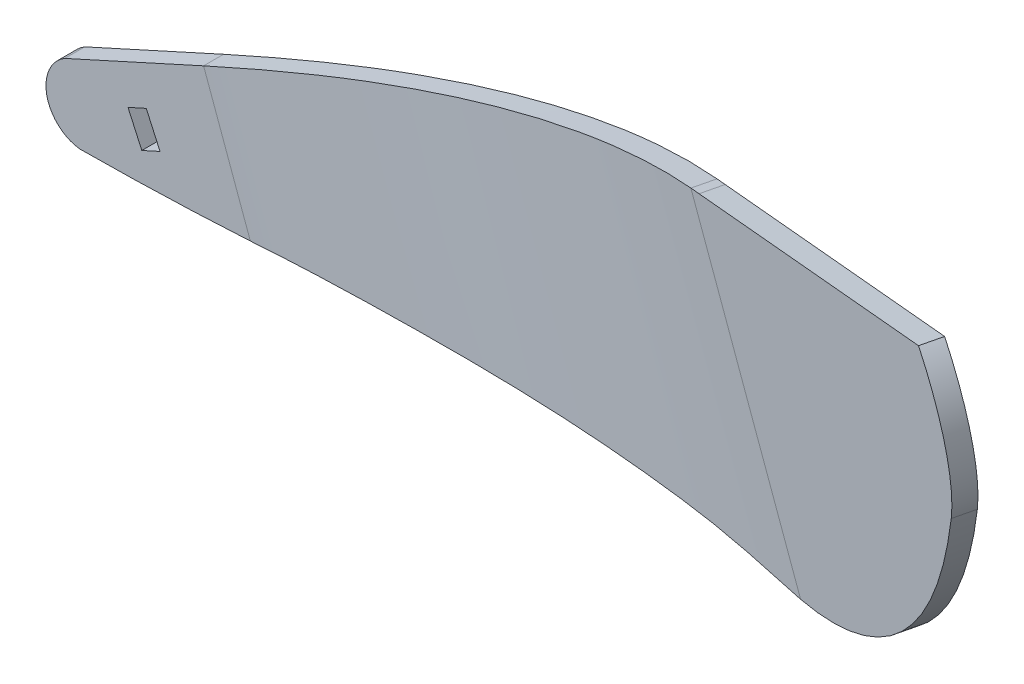
ISO-10303-21;
HEADER;
FILE_DESCRIPTION(('STEP AP214'),'2;1');
FILE_NAME('part.step','',(''),(''),'','','');
FILE_SCHEMA(('AUTOMOTIVE_DESIGN { 1 0 10303 214 1 1 1 1 }'));
ENDSEC;
DATA;
#1=APPLICATION_CONTEXT('core data for automotive mechanical design processes');
#2=APPLICATION_PROTOCOL_DEFINITION('international standard','automotive_design',2000,#1);
#3=PRODUCT_CONTEXT('',#1,'mechanical');
#4=PRODUCT('Part','Part','',(#3));
#5=PRODUCT_RELATED_PRODUCT_CATEGORY('part','',(#4));
#6=PRODUCT_DEFINITION_FORMATION('','',#4);
#7=PRODUCT_DEFINITION_CONTEXT('part definition',#1,'design');
#8=PRODUCT_DEFINITION('design','',#6,#7);
#9=PRODUCT_DEFINITION_SHAPE('','',#8);
#10=(LENGTH_UNIT() NAMED_UNIT(*) SI_UNIT(.MILLI.,.METRE.));
#11=(NAMED_UNIT(*) PLANE_ANGLE_UNIT() SI_UNIT($,.RADIAN.));
#12=(NAMED_UNIT(*) SI_UNIT($,.STERADIAN.) SOLID_ANGLE_UNIT());
#13=UNCERTAINTY_MEASURE_WITH_UNIT(LENGTH_MEASURE(1.E-05),#10,'distance_accuracy_value','');
#14=(GEOMETRIC_REPRESENTATION_CONTEXT(3) GLOBAL_UNCERTAINTY_ASSIGNED_CONTEXT((#13)) GLOBAL_UNIT_ASSIGNED_CONTEXT((#10,
#11,#12)) REPRESENTATION_CONTEXT('',''));
#15=CARTESIAN_POINT('',(0.,0.,0.));
#16=DIRECTION('',(0.,0.,1.));
#17=DIRECTION('',(1.,0.,0.));
#18=AXIS2_PLACEMENT_3D('',#15,#16,#17);
#19=CARTESIAN_POINT('',(83.014106092908,142.239745588982,13.0819028788313));
#20=DIRECTION('',(0.397093410751114,0.144647911477414,-0.906307787036649));
#21=DIRECTION('',(0.917283463911632,-0.0301308807093948,0.397093410751114));
#22=AXIS2_PLACEMENT_3D('',#19,#20,#21);
#23=CYLINDRICAL_SURFACE('',#22,58.3606331759639);
#24=CARTESIAN_POINT('',(83.6192764508927,142.460189006073,11.7006898113874));
#25=DIRECTION('',(-0.397093410751114,-0.144647911477414,0.90630778703665));
#26=DIRECTION('',(0.917283463911632,-0.0301308807093948,0.397093410751114));
#27=AXIS2_PLACEMENT_3D('',#24,#25,#26);
#28=CIRCLE('',#27,58.3606331759639);
#29=CARTESIAN_POINT('',(104.279360920723,87.8798983524995,12.0416979789016));
#30=VERTEX_POINT('',#29);
#31=CARTESIAN_POINT('',(132.600445425095,115.799936331135,28.9064887736133));
#32=VERTEX_POINT('',#31);
#33=EDGE_CURVE('E351',#30,#32,#28,.T.);
#34=ORIENTED_EDGE('',*,*,#33,.T.);
#35=DIRECTION('',(0.397093410751114,0.144647911477414,-0.906307787036649));
#36=VECTOR('',#35,1.);
#37=CARTESIAN_POINT('',(131.99527506711,115.579492914043,30.2877018410572));
#38=LINE('',#37,#36);
#39=CARTESIAN_POINT('',(131.99527506711,115.579492914043,30.2877018410572));
#40=VERTEX_POINT('',#39);
#41=EDGE_CURVE('E436',#40,#32,#38,.T.);
#42=ORIENTED_EDGE('',*,*,#41,.F.);
#43=CARTESIAN_POINT('',(83.014106092908,142.239745588982,13.0819028788313));
#44=DIRECTION('',(-0.397093410751114,-0.144647911477414,0.90630778703665));
#45=DIRECTION('',(0.917283463911632,-0.0301308807093948,0.397093410751114));
#46=AXIS2_PLACEMENT_3D('',#43,#44,#45);
#47=CIRCLE('',#46,58.3606331759639);
#48=CARTESIAN_POINT('',(103.674190562738,87.6594549354078,13.4229110463455));
#49=VERTEX_POINT('',#48);
#50=EDGE_CURVE('E421',#49,#40,#47,.T.);
#51=ORIENTED_EDGE('',*,*,#50,.F.);
#52=CARTESIAN_POINT('',(104.279360920723,87.8798983524994,12.0416979789016));
#53=CARTESIAN_POINT('',(103.674190562738,87.6594549354079,13.4229110463455));
#54=B_SPLINE_CURVE_WITH_KNOTS('',1,(#52,#53),.UNSPECIFIED.,.F.,.F.,(2,2),(0.,1.),.UNSPECIFIED.);
#55=EDGE_CURVE('E301',#30,#49,#54,.T.);
#56=ORIENTED_EDGE('',*,*,#55,.F.);
#57=EDGE_LOOP('',(#34,#42,#51,#56));
#58=FACE_BOUND('',#57,.T.);
#59=ADVANCED_FACE('F36',(#58),#23,.T.);
#60=CARTESIAN_POINT('',(96.5992940794356,111.170574986929,14.0754924818592));
#61=DIRECTION('',(-0.40636219666363,0.913140755774543,-0.0323067371643325));
#62=DIRECTION('',(-0.822913475561529,-0.381118015644391,-0.421381620257132));
#63=AXIS2_PLACEMENT_3D('',#60,#61,#62);
#64=PLANE('',#63);
#65=DIRECTION('',(-0.822913475561529,-0.381118015644391,-0.421381620257132));
#66=VECTOR('',#65,1.);
#67=CARTESIAN_POINT('',(96.5992940794356,111.170574986929,14.0754924818592));
#68=LINE('',#67,#66);
#69=CARTESIAN_POINT('',(96.5992940794356,111.170574986929,14.0754924818592));
#70=VERTEX_POINT('',#69);
#71=CARTESIAN_POINT('',(95.3248719609345,110.580348622529,13.4229110463455));
#72=VERTEX_POINT('',#71);
#73=EDGE_CURVE('E423',#70,#72,#68,.T.);
#74=ORIENTED_EDGE('',*,*,#73,.F.);
#75=DIRECTION('',(0.397093410751114,0.144647911477414,-0.906307787036649));
#76=VECTOR('',#75,1.);
#77=CARTESIAN_POINT('',(96.5992940794356,111.170574986929,14.0754924818592));
#78=LINE('',#77,#76);
#79=CARTESIAN_POINT('',(97.2044644374203,111.391018404021,12.6942794144154));
#80=VERTEX_POINT('',#79);
#81=EDGE_CURVE('E430',#70,#80,#78,.T.);
#82=ORIENTED_EDGE('',*,*,#81,.T.);
#83=DIRECTION('',(-0.822913475561529,-0.381118015644391,-0.421381620257132));
#84=VECTOR('',#83,1.);
#85=CARTESIAN_POINT('',(97.2044644374203,111.391018404021,12.6942794144154));
#86=LINE('',#85,#84);
#87=CARTESIAN_POINT('',(95.9300423189192,110.800792039621,12.0416979789017));
#88=VERTEX_POINT('',#87);
#89=EDGE_CURVE('E429',#80,#88,#86,.T.);
#90=ORIENTED_EDGE('',*,*,#89,.T.);
#91=CARTESIAN_POINT('',(95.3248719609345,110.580348622529,13.4229110463455));
#92=CARTESIAN_POINT('',(95.9300423189192,110.80079203962,12.0416979789016));
#93=B_SPLINE_CURVE_WITH_KNOTS('',1,(#91,#92),.UNSPECIFIED.,.F.,.F.,(2,2),(0.,1.),.UNSPECIFIED.);
#94=EDGE_CURVE('E11',#72,#88,#93,.T.);
#95=ORIENTED_EDGE('',*,*,#94,.F.);
#96=EDGE_LOOP('',(#74,#82,#90,#95));
#97=FACE_BOUND('',#96,.T.);
#98=ADVANCED_FACE('F38',(#97),#64,.T.);
#99=CARTESIAN_POINT('',(32.7005911916889,324.934882128188,18.5141685714529));
#100=DIRECTION('',(0.397093410751114,0.144647911477414,-0.90630778703665));
#101=DIRECTION('',(0.917283463911632,-0.0301308807093948,0.397093410751114));
#102=AXIS2_PLACEMENT_3D('',#99,#100,#101);
#103=PLANE('',#102);
#104=ORIENTED_EDGE('',*,*,#89,.F.);
#105=DIRECTION('',(-0.822784282779922,-0.381408213456814,-0.421371331153426));
#106=VECTOR('',#105,1.);
#107=CARTESIAN_POINT('',(131.427037788079,127.255165100489,30.2206366748398));
#108=LINE('',#107,#106);
#109=CARTESIAN_POINT('',(131.427037788079,127.255165100489,30.2206366748398));
#110=VERTEX_POINT('',#109);
#111=EDGE_CURVE('E427',#110,#80,#108,.T.);
#112=ORIENTED_EDGE('',*,*,#111,.F.);
#113=CARTESIAN_POINT('',(122.932266417406,121.062287162069,25.5103112666063));
#114=DIRECTION('',(-0.397093410751114,-0.144647911477414,0.90630778703665));
#115=DIRECTION('',(0.917283463911632,-0.0301308807093948,0.397093410751114));
#116=AXIS2_PLACEMENT_3D('',#113,#114,#115);
#117=CIRCLE('',#116,11.5195504795819);
#118=EDGE_CURVE('E424',#32,#110,#117,.T.);
#119=ORIENTED_EDGE('',*,*,#118,.F.);
#120=ORIENTED_EDGE('',*,*,#33,.F.);
#121=DIRECTION('',(0.342266117137559,-0.93960305717871,0.));
#122=VECTOR('',#121,1.);
#123=CARTESIAN_POINT('',(19.6586583606416,320.184140125012,12.0416979789016));
#124=LINE('',#123,#122);
#125=EDGE_CURVE('E48',#88,#30,#124,.T.);
#126=ORIENTED_EDGE('',*,*,#125,.F.);
#127=EDGE_LOOP('',(#104,#112,#119,#120,#126));
#128=FACE_BOUND('',#127,.T.);
#129=ADVANCED_FACE('F476',(#128),#103,.T.);
#130=CARTESIAN_POINT('',(130.821867430095,127.034721683398,31.6018497422836));
#131=DIRECTION('',(-0.406623716903448,0.91301958161526,-0.0324406602694974));
#132=DIRECTION('',(-0.822784282779922,-0.381408213456814,-0.421371331153426));
#133=AXIS2_PLACEMENT_3D('',#130,#131,#132);
#134=PLANE('',#133);
#135=ORIENTED_EDGE('',*,*,#111,.T.);
#136=ORIENTED_EDGE('',*,*,#81,.F.);
#137=DIRECTION('',(-0.822784282779922,-0.381408213456814,-0.421371331153426));
#138=VECTOR('',#137,1.);
#139=CARTESIAN_POINT('',(130.821867430095,127.034721683398,31.6018497422836));
#140=LINE('',#139,#138);
#141=CARTESIAN_POINT('',(130.821867430095,127.034721683398,31.6018497422836));
#142=VERTEX_POINT('',#141);
#143=EDGE_CURVE('E420',#142,#70,#140,.T.);
#144=ORIENTED_EDGE('',*,*,#143,.F.);
#145=DIRECTION('',(0.397093410751114,0.144647911477414,-0.906307787036649));
#146=VECTOR('',#145,1.);
#147=CARTESIAN_POINT('',(130.821867430095,127.034721683398,31.6018497422836));
#148=LINE('',#147,#146);
#149=EDGE_CURVE('E434',#142,#110,#148,.T.);
#150=ORIENTED_EDGE('',*,*,#149,.T.);
#151=EDGE_LOOP('',(#135,#136,#144,#150));
#152=FACE_BOUND('',#151,.T.);
#153=ADVANCED_FACE('F402',(#152),#134,.T.);
#154=CARTESIAN_POINT('',(122.327096059422,120.841843744977,26.8915243340501));
#155=DIRECTION('',(0.397093410751114,0.144647911477414,-0.906307787036649));
#156=DIRECTION('',(0.917283463911632,-0.0301308807093948,0.397093410751114));
#157=AXIS2_PLACEMENT_3D('',#154,#155,#156);
#158=CYLINDRICAL_SURFACE('',#157,11.5195504795819);
#159=ORIENTED_EDGE('',*,*,#118,.T.);
#160=ORIENTED_EDGE('',*,*,#149,.F.);
#161=CARTESIAN_POINT('',(122.327096059422,120.841843744977,26.8915243340501));
#162=DIRECTION('',(-0.397093410751114,-0.144647911477414,0.90630778703665));
#163=DIRECTION('',(0.917283463911632,-0.0301308807093948,0.397093410751114));
#164=AXIS2_PLACEMENT_3D('',#161,#162,#163);
#165=CIRCLE('',#164,11.5195504795819);
#166=EDGE_CURVE('E418',#40,#142,#165,.T.);
#167=ORIENTED_EDGE('',*,*,#166,.F.);
#168=ORIENTED_EDGE('',*,*,#41,.T.);
#169=EDGE_LOOP('',(#159,#160,#167,#168));
#170=FACE_BOUND('',#169,.T.);
#171=ADVANCED_FACE('F480',(#170),#158,.T.);
#172=CARTESIAN_POINT('',(32.0954208337042,324.714438711096,19.8953816388968));
#173=DIRECTION('',(0.397093410751114,0.144647911477414,-0.90630778703665));
#174=DIRECTION('',(0.917283463911632,-0.0301308807093948,0.397093410751114));
#175=AXIS2_PLACEMENT_3D('',#172,#173,#174);
#176=PLANE('',#175);
#177=DIRECTION('',(0.342266117137559,-0.93960305717871,0.));
#178=VECTOR('',#177,1.);
#179=CARTESIAN_POINT('',(19.0534880026569,319.96369670792,13.4229110463455));
#180=LINE('',#179,#178);
#181=EDGE_CURVE('E433',#72,#49,#180,.T.);
#182=ORIENTED_EDGE('',*,*,#181,.T.);
#183=ORIENTED_EDGE('',*,*,#50,.T.);
#184=ORIENTED_EDGE('',*,*,#166,.T.);
#185=ORIENTED_EDGE('',*,*,#143,.T.);
#186=ORIENTED_EDGE('',*,*,#73,.T.);
#187=EDGE_LOOP('',(#182,#183,#184,#185,#186));
#188=FACE_BOUND('',#187,.T.);
#189=ADVANCED_FACE('F483',(#188),#176,.F.);
#190=CARTESIAN_POINT('',(37.2781516197468,80.901977041363,1.524));
#191=DIRECTION('',(0.,0.,-1.));
#192=DIRECTION('',(1.,0.,0.));
#193=AXIS2_PLACEMENT_3D('',#190,#191,#192);
#194=CYLINDRICAL_SURFACE('',#193,2.91276832147742);
#195=CARTESIAN_POINT('',(37.2781516197468,80.901977041363,0.));
#196=DIRECTION('',(0.,0.,1.));
#197=DIRECTION('',(-1.,0.,0.));
#198=AXIS2_PLACEMENT_3D('',#195,#196,#197);
#199=CIRCLE('',#198,2.91276832147742);
#200=CARTESIAN_POINT('',(35.7950190023547,83.4088749120052,0.));
#201=VERTEX_POINT('',#200);
#202=CARTESIAN_POINT('',(36.9222362440405,78.0110354058507,0.));
#203=VERTEX_POINT('',#202);
#204=EDGE_CURVE('E353',#201,#203,#199,.T.);
#205=ORIENTED_EDGE('',*,*,#204,.T.);
#206=DIRECTION('',(0.,0.,-1.));
#207=VECTOR('',#206,1.);
#208=CARTESIAN_POINT('',(36.9222362440405,78.0110354058507,1.524));
#209=LINE('',#208,#207);
#210=CARTESIAN_POINT('',(36.9222362440405,78.0110354058507,1.524));
#211=VERTEX_POINT('',#210);
#212=EDGE_CURVE('E358',#211,#203,#209,.T.);
#213=ORIENTED_EDGE('',*,*,#212,.F.);
#214=CARTESIAN_POINT('',(37.2781516197468,80.901977041363,1.524));
#215=DIRECTION('',(0.,0.,1.));
#216=DIRECTION('',(-1.,0.,0.));
#217=AXIS2_PLACEMENT_3D('',#214,#215,#216);
#218=CIRCLE('',#217,2.91276832147742);
#219=CARTESIAN_POINT('',(35.7950190023547,83.4088749120052,1.524));
#220=VERTEX_POINT('',#219);
#221=EDGE_CURVE('E362',#220,#211,#218,.T.);
#222=ORIENTED_EDGE('',*,*,#221,.F.);
#223=DIRECTION('',(0.,0.,-1.));
#224=VECTOR('',#223,1.);
#225=CARTESIAN_POINT('',(35.7950190023547,83.4088749120052,1.524));
#226=LINE('',#225,#224);
#227=EDGE_CURVE('E343',#220,#201,#226,.T.);
#228=ORIENTED_EDGE('',*,*,#227,.T.);
#229=EDGE_LOOP('',(#205,#213,#222,#228));
#230=FACE_BOUND('',#229,.T.);
#231=ADVANCED_FACE('F564',(#230),#194,.T.);
#232=CARTESIAN_POINT('',(35.3300841042553,325.892718868233,1.524));
#233=DIRECTION('',(0.,0.,-1.));
#234=DIRECTION('',(1.,0.,0.));
#235=AXIS2_PLACEMENT_3D('',#232,#233,#234);
#236=PLANE('',#235);
#237=DIRECTION('',(-0.413091850992311,0.910689366712792,0.));
#238=VECTOR('',#237,1.);
#239=CARTESIAN_POINT('',(41.9946653098515,83.2168798130125,1.524));
#240=LINE('',#239,#238);
#241=CARTESIAN_POINT('',(43.0439186113719,80.903728821562,1.524));
#242=VERTEX_POINT('',#241);
#243=CARTESIAN_POINT('',(41.9946653098515,83.2168798130125,1.524));
#244=VERTEX_POINT('',#243);
#245=EDGE_CURVE('E148',#242,#244,#240,.T.);
#246=ORIENTED_EDGE('',*,*,#245,.F.);
#247=DIRECTION('',(0.910689366712794,0.413091850992307,0.));
#248=VECTOR('',#247,1.);
#249=CARTESIAN_POINT('',(41.6560280165016,80.2741768406497,1.524));
#250=LINE('',#249,#248);
#251=CARTESIAN_POINT('',(41.6560280165017,80.2741768406497,1.524));
#252=VERTEX_POINT('',#251);
#253=EDGE_CURVE('E161',#252,#242,#250,.T.);
#254=ORIENTED_EDGE('',*,*,#253,.F.);
#255=DIRECTION('',(0.413091850992311,-0.910689366712792,0.));
#256=VECTOR('',#255,1.);
#257=CARTESIAN_POINT('',(40.6067747149812,82.5873278321002,1.524));
#258=LINE('',#257,#256);
#259=CARTESIAN_POINT('',(40.6067747149812,82.5873278321002,1.524));
#260=VERTEX_POINT('',#259);
#261=EDGE_CURVE('E143',#260,#252,#258,.T.);
#262=ORIENTED_EDGE('',*,*,#261,.F.);
#263=DIRECTION('',(-0.910689366712794,-0.413091850992307,0.));
#264=VECTOR('',#263,1.);
#265=CARTESIAN_POINT('',(40.6067747149812,82.5873278321002,1.524));
#266=LINE('',#265,#264);
#267=EDGE_CURVE('E151',#244,#260,#266,.T.);
#268=ORIENTED_EDGE('',*,*,#267,.F.);
#269=EDGE_LOOP('',(#246,#254,#262,#268));
#270=FACE_BOUND('',#269,.T.);
#271=DIRECTION('',(-0.910689366712793,-0.413091850992309,0.));
#272=VECTOR('',#271,1.);
#273=CARTESIAN_POINT('',(98.6216454393514,111.907250269281,1.524));
#274=LINE('',#273,#272);
#275=CARTESIAN_POINT('',(46.3551161989758,88.1989715762025,1.524));
#276=VERTEX_POINT('',#275);
#277=EDGE_CURVE('E352',#276,#220,#274,.T.);
#278=ORIENTED_EDGE('',*,*,#277,.T.);
#279=ORIENTED_EDGE('',*,*,#221,.T.);
#280=CARTESIAN_POINT('',(35.3300841042553,325.892718868233,1.524));
#281=DIRECTION('',(0.,0.,1.));
#282=DIRECTION('',(1.,0.,0.));
#283=AXIS2_PLACEMENT_3D('',#280,#281,#282);
#284=CIRCLE('',#283,247.886796632215);
#285=CARTESIAN_POINT('',(49.9117445695242,78.4351687254731,1.52399999999997));
#286=VERTEX_POINT('',#285);
#287=EDGE_CURVE('E365',#211,#286,#284,.T.);
#288=ORIENTED_EDGE('',*,*,#287,.T.);
#289=DIRECTION('',(0.342266117137559,-0.93960305717871,0.));
#290=VECTOR('',#289,1.);
#291=CARTESIAN_POINT('',(-31.3773751627346,301.593411950288,1.524));
#292=LINE('',#291,#290);
#293=EDGE_CURVE('E361',#276,#286,#292,.T.);
#294=ORIENTED_EDGE('',*,*,#293,.F.);
#295=EDGE_LOOP('',(#278,#279,#288,#294));
#296=FACE_BOUND('',#295,.T.);
#297=ADVANCED_FACE('F159',(#270,#296),#236,.F.);
#298=CARTESIAN_POINT('',(35.3300841042553,325.892718868233,1.524));
#299=DIRECTION('',(0.,0.,-1.));
#300=DIRECTION('',(1.,0.,0.));
#301=AXIS2_PLACEMENT_3D('',#298,#299,#300);
#302=CYLINDRICAL_SURFACE('',#301,247.886796632215);
#303=CARTESIAN_POINT('',(49.9117445695242,78.4351687254731,1.52399999999997));
#304=CARTESIAN_POINT('',(49.9117445695242,78.4351687254731,0.));
#305=B_SPLINE_CURVE_WITH_KNOTS('',1,(#303,#304),.UNSPECIFIED.,.F.,.F.,(2,2),(0.,1.),.UNSPECIFIED.);
#306=CARTESIAN_POINT('',(49.9117445695242,78.4351687254731,0.));
#307=VERTEX_POINT('',#306);
#308=EDGE_CURVE('E339',#307,#286,#305,.F.);
#309=ORIENTED_EDGE('',*,*,#308,.T.);
#310=ORIENTED_EDGE('',*,*,#287,.F.);
#311=ORIENTED_EDGE('',*,*,#212,.T.);
#312=CARTESIAN_POINT('',(35.3300841042553,325.892718868233,0.));
#313=DIRECTION('',(0.,0.,1.));
#314=DIRECTION('',(1.,0.,0.));
#315=AXIS2_PLACEMENT_3D('',#312,#313,#314);
#316=CIRCLE('',#315,247.886796632215);
#317=EDGE_CURVE('E356',#203,#307,#316,.T.);
#318=ORIENTED_EDGE('',*,*,#317,.T.);
#319=EDGE_LOOP('',(#309,#310,#311,#318));
#320=FACE_BOUND('',#319,.T.);
#321=ADVANCED_FACE('F383',(#320),#302,.T.);
#322=CARTESIAN_POINT('',(35.3300841042553,325.892718868233,0.));
#323=DIRECTION('',(0.,0.,-1.));
#324=DIRECTION('',(1.,0.,0.));
#325=AXIS2_PLACEMENT_3D('',#322,#323,#324);
#326=PLANE('',#325);
#327=DIRECTION('',(-0.910689366712794,-0.413091850992307,0.));
#328=VECTOR('',#327,1.);
#329=CARTESIAN_POINT('',(40.6067747149812,82.5873278321002,0.));
#330=LINE('',#329,#328);
#331=CARTESIAN_POINT('',(41.9946653098515,83.2168798130125,0.));
#332=VERTEX_POINT('',#331);
#333=CARTESIAN_POINT('',(40.6067747149812,82.5873278321002,0.));
#334=VERTEX_POINT('',#333);
#335=EDGE_CURVE('E166',#332,#334,#330,.T.);
#336=ORIENTED_EDGE('',*,*,#335,.T.);
#337=DIRECTION('',(0.413091850992311,-0.910689366712792,0.));
#338=VECTOR('',#337,1.);
#339=CARTESIAN_POINT('',(40.6067747149812,82.5873278321002,0.));
#340=LINE('',#339,#338);
#341=CARTESIAN_POINT('',(41.6560280165016,80.2741768406497,0.));
#342=VERTEX_POINT('',#341);
#343=EDGE_CURVE('E146',#334,#342,#340,.T.);
#344=ORIENTED_EDGE('',*,*,#343,.T.);
#345=DIRECTION('',(0.910689366712794,0.413091850992307,0.));
#346=VECTOR('',#345,1.);
#347=CARTESIAN_POINT('',(41.6560280165016,80.2741768406497,0.));
#348=LINE('',#347,#346);
#349=CARTESIAN_POINT('',(43.0439186113719,80.903728821562,0.));
#350=VERTEX_POINT('',#349);
#351=EDGE_CURVE('E169',#342,#350,#348,.T.);
#352=ORIENTED_EDGE('',*,*,#351,.T.);
#353=DIRECTION('',(-0.413091850992311,0.910689366712792,0.));
#354=VECTOR('',#353,1.);
#355=CARTESIAN_POINT('',(41.9946653098515,83.2168798130125,0.));
#356=LINE('',#355,#354);
#357=EDGE_CURVE('E157',#350,#332,#356,.T.);
#358=ORIENTED_EDGE('',*,*,#357,.T.);
#359=EDGE_LOOP('',(#336,#344,#352,#358));
#360=FACE_BOUND('',#359,.T.);
#361=DIRECTION('',(0.342266117137559,-0.93960305717871,0.));
#362=VECTOR('',#361,1.);
#363=CARTESIAN_POINT('',(-31.3773751627346,301.593411950288,0.));
#364=LINE('',#363,#362);
#365=CARTESIAN_POINT('',(46.3551161989758,88.1989715762025,0.));
#366=VERTEX_POINT('',#365);
#367=EDGE_CURVE('E381',#366,#307,#364,.T.);
#368=ORIENTED_EDGE('',*,*,#367,.T.);
#369=ORIENTED_EDGE('',*,*,#317,.F.);
#370=ORIENTED_EDGE('',*,*,#204,.F.);
#371=DIRECTION('',(-0.910689366712793,-0.413091850992309,0.));
#372=VECTOR('',#371,1.);
#373=CARTESIAN_POINT('',(98.6216454393514,111.907250269281,0.));
#374=LINE('',#373,#372);
#375=EDGE_CURVE('E357',#366,#201,#374,.T.);
#376=ORIENTED_EDGE('',*,*,#375,.F.);
#377=EDGE_LOOP('',(#368,#369,#370,#376));
#378=FACE_BOUND('',#377,.T.);
#379=ADVANCED_FACE('F393',(#360,#378),#326,.T.);
#380=CARTESIAN_POINT('',(98.6216454393514,111.907250269281,1.524));
#381=DIRECTION('',(-0.413091850992309,0.910689366712793,0.));
#382=DIRECTION('',(-0.910689366712793,-0.413091850992309,0.));
#383=AXIS2_PLACEMENT_3D('',#380,#381,#382);
#384=PLANE('',#383);
#385=CARTESIAN_POINT('',(46.3551161989758,88.1989715762025,0.));
#386=CARTESIAN_POINT('',(46.3551161989758,88.1989715762025,1.52399999999997));
#387=B_SPLINE_CURVE_WITH_KNOTS('',1,(#385,#386),.UNSPECIFIED.,.F.,.F.,(2,2),(0.,1.),.UNSPECIFIED.);
#388=EDGE_CURVE('E326',#276,#366,#387,.F.);
#389=ORIENTED_EDGE('',*,*,#388,.T.);
#390=ORIENTED_EDGE('',*,*,#375,.T.);
#391=ORIENTED_EDGE('',*,*,#227,.F.);
#392=ORIENTED_EDGE('',*,*,#277,.F.);
#393=EDGE_LOOP('',(#389,#390,#391,#392));
#394=FACE_BOUND('',#393,.T.);
#395=ADVANCED_FACE('F396',(#394),#384,.T.);
#396=CARTESIAN_POINT('',(46.3551161989758,88.1989715762025,0.));
#397=CARTESIAN_POINT('',(54.8937722532483,92.0665536068937,0.));
#398=CARTESIAN_POINT('',(63.4318040711659,95.9338822291465,1.02357284543216));
#399=CARTESIAN_POINT('',(80.0924845532157,103.517255237512,5.06949111640319));
#400=CARTESIAN_POINT('',(88.2142079691066,107.232936566575,8.09161625987283));
#401=CARTESIAN_POINT('',(95.9300423189192,110.80079203962,12.0416979789016));
#402=CARTESIAN_POINT('',(46.3551161989758,88.1989715762025,1.52399999999997));
#403=CARTESIAN_POINT('',(54.7896357334243,92.0286201373076,1.52399999999997));
#404=CARTESIAN_POINT('',(63.2235385730631,95.858018040727,2.53543561801597));
#405=CARTESIAN_POINT('',(79.6808864509644,103.367323749739,6.53337857352094));
#406=CARTESIAN_POINT('',(87.7034173498989,107.046872548509,9.5196682503081));
#407=CARTESIAN_POINT('',(95.3248719609345,110.580348622529,13.4229110463455));
#408=B_SPLINE_SURFACE_WITH_KNOTS('',1,3,((#396,#397,#398,#399,#400,#401),(#402,#403,#404,#405,
#406,#407)),.UNSPECIFIED.,.F.,.F.,.F.,(2,2),(4,2,4),(0.,1.),(0.,0.5,1.),.UNSPECIFIED.);
#409=CARTESIAN_POINT('',(46.3551161989758,88.1989715762025,1.52399999999997));
#410=CARTESIAN_POINT('',(54.7896357334243,92.0286201373076,1.52399999999997));
#411=CARTESIAN_POINT('',(63.2235385730631,95.858018040727,2.53543561801597));
#412=CARTESIAN_POINT('',(79.6808864509644,103.367323749739,6.53337857352094));
#413=CARTESIAN_POINT('',(87.7034173498989,107.046872548509,9.5196682503081));
#414=CARTESIAN_POINT('',(95.3248719609345,110.580348622529,13.4229110463455));
#415=B_SPLINE_CURVE_WITH_KNOTS('',3,(#409,#410,#411,#412,#413,#414),.UNSPECIFIED.,.F.,.F.,(4,2,
4),(0.,0.5,1.),.UNSPECIFIED.);
#416=EDGE_CURVE('E484',#276,#72,#415,.T.);
#417=CARTESIAN_POINT('',(95.9300423189192,110.80079203962,12.0416979789016));
#418=CARTESIAN_POINT('',(88.2142079691066,107.232936566575,8.09161625987283));
#419=CARTESIAN_POINT('',(80.0924845532157,103.517255237512,5.06949111640319));
#420=CARTESIAN_POINT('',(63.4318040711659,95.9338822291465,1.02357284543216));
#421=CARTESIAN_POINT('',(54.8937722532483,92.0665536068937,0.));
#422=CARTESIAN_POINT('',(46.3551161989758,88.1989715762025,0.));
#423=B_SPLINE_CURVE_WITH_KNOTS('',3,(#417,#418,#419,#420,#421,#422),.UNSPECIFIED.,.F.,.F.,(4,2,
4),(0.,0.5,1.),.UNSPECIFIED.);
#424=EDGE_CURVE('E175',#366,#88,#423,.F.);
#425=ORIENTED_EDGE('',*,*,#388,.F.);
#426=ORIENTED_EDGE('',*,*,#416,.T.);
#427=ORIENTED_EDGE('',*,*,#94,.T.);
#428=ORIENTED_EDGE('',*,*,#424,.F.);
#429=EDGE_LOOP('',(#425,#426,#427,#428));
#430=FACE_BOUND('',#429,.T.);
#431=ADVANCED_FACE('F258',(#430),#408,.T.);
#432=CARTESIAN_POINT('',(104.279360920723,87.8798983524994,12.0416979789016));
#433=CARTESIAN_POINT('',(102.029669619416,87.0635004781184,10.9257108342432));
#434=CARTESIAN_POINT('',(99.5720209472463,86.3372960787906,9.82257774276949));
#435=CARTESIAN_POINT('',(96.9012234431022,85.6994125576863,8.76032570054251));
#436=CARTESIAN_POINT('',(103.674190562738,87.6594549354079,13.4229110463455));
#437=CARTESIAN_POINT('',(101.451163681757,86.8527700217424,12.3201569614334));
#438=CARTESIAN_POINT('',(99.0220124426963,86.1369462926248,11.230104476703));
#439=CARTESIAN_POINT('',(96.3816070289747,85.5101335945054,10.1804483206942));
#440=B_SPLINE_SURFACE_WITH_KNOTS('',1,3,((#432,#433,#434,#435),(#436,#437,#438,#439)),
.UNSPECIFIED.,.F.,.F.,.F.,(2,2),(4,4),(0.,1.),(0.,1.),.UNSPECIFIED.);
#441=CARTESIAN_POINT('',(103.674190562738,87.6594549354079,13.4229110463455));
#442=CARTESIAN_POINT('',(101.451163681757,86.8527700217424,12.3201569614334));
#443=CARTESIAN_POINT('',(99.0220124426963,86.1369462926248,11.230104476703));
#444=CARTESIAN_POINT('',(96.3816070289747,85.5101335945054,10.1804483206942));
#445=B_SPLINE_CURVE_WITH_KNOTS('',3,(#441,#442,#443,#444),.UNSPECIFIED.,.F.,.F.,(4,4),(0.,1.),.UNSPECIFIED.);
#446=CARTESIAN_POINT('',(96.3816070289747,85.5101335945054,10.1804483206942));
#447=VERTEX_POINT('',#446);
#448=EDGE_CURVE('E221',#49,#447,#445,.T.);
#449=CARTESIAN_POINT('',(96.9012234431022,85.6994125576863,8.76032570054249));
#450=CARTESIAN_POINT('',(96.3816070289747,85.5101335945054,10.1804483206942));
#451=B_SPLINE_CURVE_WITH_KNOTS('',1,(#449,#450),.UNSPECIFIED.,.F.,.F.,(2,2),(0.,1.),.UNSPECIFIED.);
#452=CARTESIAN_POINT('',(96.9012234431022,85.6994125576863,8.76032570054251));
#453=VERTEX_POINT('',#452);
#454=EDGE_CURVE('E291',#453,#447,#451,.T.);
#455=CARTESIAN_POINT('',(96.9012234431022,85.6994125576863,8.76032570054251));
#456=CARTESIAN_POINT('',(99.5720209472463,86.3372960787906,9.82257774276949));
#457=CARTESIAN_POINT('',(102.029669619416,87.0635004781184,10.9257108342432));
#458=CARTESIAN_POINT('',(104.279360920723,87.8798983524994,12.0416979789016));
#459=B_SPLINE_CURVE_WITH_KNOTS('',3,(#455,#456,#457,#458),.UNSPECIFIED.,.F.,.F.,(4,4),(0.,1.),.UNSPECIFIED.);
#460=EDGE_CURVE('E230',#30,#453,#459,.F.);
#461=ORIENTED_EDGE('',*,*,#55,.T.);
#462=ORIENTED_EDGE('',*,*,#448,.T.);
#463=ORIENTED_EDGE('',*,*,#454,.F.);
#464=ORIENTED_EDGE('',*,*,#460,.F.);
#465=EDGE_LOOP('',(#461,#462,#463,#464));
#466=FACE_BOUND('',#465,.T.);
#467=ADVANCED_FACE('F247',(#466),#440,.T.);
#468=CARTESIAN_POINT('',(96.9012234431022,85.6994125576863,8.76032570054249));
#469=CARTESIAN_POINT('',(94.548673446871,85.1311282349025,7.82379540264205));
#470=CARTESIAN_POINT('',(92.4236552640698,84.6290288775423,7.06176165566579));
#471=CARTESIAN_POINT('',(89.602894444786,83.9845065815051,6.11762527108106));
#472=CARTESIAN_POINT('',(88.7236756020016,83.7877324104199,5.83621346966934));
#473=CARTESIAN_POINT('',(87.4986750982567,83.5204999759663,5.45751298023844));
#474=CARTESIAN_POINT('',(87.1059735388889,83.436075109284,5.33852505595712));
#475=CARTESIAN_POINT('',(86.5406034176089,83.3165020759583,5.17018094025863));
#476=CARTESIAN_POINT('',(86.3560934201418,83.2778216569714,5.11575647048583));
#477=CARTESIAN_POINT('',(86.0852749514906,83.2215765563035,5.03656930462011));
#478=CARTESIAN_POINT('',(85.9959931975328,83.2031241037956,5.01058187763457));
#479=CARTESIAN_POINT('',(85.8635603103081,83.175890440521,4.97220280066571));
#480=CARTESIAN_POINT('',(85.8196643040399,83.1668867215936,4.95951012135041));
#481=CARTESIAN_POINT('',(85.7541931111862,83.1534925357215,4.94062034636497));
#482=CARTESIAN_POINT('',(85.7324315162561,83.1490463724918,4.934348628853));
#483=CARTESIAN_POINT('',(85.6998823750554,83.1424049929184,4.92497820573763));
#484=CARTESIAN_POINT('',(85.6890482031832,83.1401958439375,4.92186092356744));
#485=CARTESIAN_POINT('',(85.6728202640234,83.136889088915,4.91719426894119));
#486=CARTESIAN_POINT('',(85.6674148374113,83.1357879986488,4.91564026217121));
#487=CARTESIAN_POINT('',(85.6593125278844,83.1341381056273,4.91331156672056));
#488=CARTESIAN_POINT('',(85.6566127297739,83.1335884316831,4.91253572068777));
#489=CARTESIAN_POINT('',(85.6512150771381,83.1324896646315,4.91098479978185));
#490=CARTESIAN_POINT('',(85.6494434493205,83.1321290542092,4.91047578694771));
#491=CARTESIAN_POINT('',(83.7907883375012,82.7539016686571,4.37657024877585));
#492=CARTESIAN_POINT('',(81.8898357923739,82.3911006211966,3.87883417738187));
#493=CARTESIAN_POINT('',(78.9710590116565,81.8694909957128,3.19113360256133));
#494=CARTESIAN_POINT('',(77.9869135878899,81.6993882043571,2.97171880809634));
#495=CARTESIAN_POINT('',(76.4941022717911,81.4499708157298,2.65811291256818));
#496=CARTESIAN_POINT('',(75.9937332899158,81.3677879359051,2.55616373849616));
#497=CARTESIAN_POINT('',(75.2390645008525,81.2459598288711,2.40721831770895));
#498=CARTESIAN_POINT('',(74.9868223723698,81.2055915028069,2.35823290494366));
#499=CARTESIAN_POINT('',(74.6074346304074,81.145402125884,2.28576180670979));
#500=CARTESIAN_POINT('',(74.4808012928507,81.1253995194135,2.26177261102214));
#501=CARTESIAN_POINT('',(74.2905956940592,81.0954865862229,2.22604212887743));
#502=CARTESIAN_POINT('',(74.2271512291346,81.0855307712751,2.21417418674125));
#503=CARTESIAN_POINT('',(74.1001771934331,81.0656495002636,2.19052299909576));
#504=CARTESIAN_POINT('',(74.0375715779594,81.0558680797178,2.17891039366484));
#505=CARTESIAN_POINT('',(71.9092024908679,80.7240763328287,1.78583394669182));
#506=CARTESIAN_POINT('',(69.8790721484618,80.4301621695657,1.46389511801215));
#507=CARTESIAN_POINT('',(66.8893179835667,80.0327842748883,1.05955837179189));
#508=CARTESIAN_POINT('',(65.9019627229225,79.907569947472,0.937876895837166));
#509=CARTESIAN_POINT('',(64.4352848936043,79.7308020055581,0.773741078081087));
#510=CARTESIAN_POINT('',(63.9487841749019,79.6737213908997,0.722093724327646));
#511=CARTESIAN_POINT('',(63.2226793554595,79.5908847990735,0.649063888619915));
#512=CARTESIAN_POINT('',(62.9812520883937,79.5637366433398,0.62546082221591));
#513=CARTESIAN_POINT('',(62.6200296707376,79.5237130123822,0.591147200840631));
#514=CARTESIAN_POINT('',(62.4997752764147,79.5104882350132,0.57989115760786));
#515=CARTESIAN_POINT('',(62.3196241537831,79.4908260285611,0.563277428879676));
#516=CARTESIAN_POINT('',(62.2596121909082,79.4843011196265,0.557784575378365));
#517=CARTESIAN_POINT('',(62.1696519687852,79.4745575343641,0.549612578518346));
#518=CARTESIAN_POINT('',(62.1396748484337,79.4713169689635,0.546899793467122));
#519=CARTESIAN_POINT('',(62.0947236115109,79.4664670701537,0.542847399184549));
#520=CARTESIAN_POINT('',(62.0797422731369,79.4648522620988,0.541499398306293));
#521=CARTESIAN_POINT('',(62.057273878105,79.4624327879322,0.539481588119892));
#522=CARTESIAN_POINT('',(62.0497850151825,79.4616267528627,0.538809683246262));
#523=CARTESIAN_POINT('',(62.0385526241344,79.4604183848114,0.537802873132106));
#524=CARTESIAN_POINT('',(62.034808644341,79.4600157095531,0.537467444293423));
#525=CARTESIAN_POINT('',(62.0273209858998,79.4592105872333,0.536796935583769));
#526=CARTESIAN_POINT('',(62.0225384581235,79.4586964906166,0.536368917656778));
#527=CARTESIAN_POINT('',(60.635038167326,79.3095759053471,0.412239651720926));
#528=CARTESIAN_POINT('',(58.9342245579093,79.1501067089561,0.281371824657113));
#529=CARTESIAN_POINT('',(54.8981819640756,78.8090229982309,0.0752470749524536));
#530=CARTESIAN_POINT('',(52.5629134854387,78.6273529911471,0.));
#531=CARTESIAN_POINT('',(49.9117445695242,78.4351687254731,0.));
#532=CARTESIAN_POINT('',(96.3816070289747,85.5101335945054,10.1804483206942));
#533=CARTESIAN_POINT('',(94.0558521055433,84.9516098206024,9.25502313864284));
#534=CARTESIAN_POINT('',(91.9549945949823,84.4583113961142,8.50202535144841));
#535=CARTESIAN_POINT('',(89.1662210610117,83.825441003355,7.56908425996152));
#536=CARTESIAN_POINT('',(88.2969568020842,83.6322929558103,7.29100935738077));
#537=CARTESIAN_POINT('',(87.0857994236768,83.3701031111207,6.91679938758739));
#538=CARTESIAN_POINT('',(86.6975308523755,83.2872930344301,6.7992223873094));
#539=CARTESIAN_POINT('',(86.1385353543065,83.1700420641479,6.63287444689588));
#540=CARTESIAN_POINT('',(85.956104425302,83.1321189805958,6.57909532656703));
#541=CARTESIAN_POINT('',(85.6883355366408,83.0769847404069,6.50084713895268));
#542=CARTESIAN_POINT('',(85.6000588057877,83.0588983843618,6.47516786327526));
#543=CARTESIAN_POINT('',(85.469116160645,83.032207566672,6.4372438741756));
#544=CARTESIAN_POINT('',(85.4257140196553,83.0233837464261,6.42470170093914));
#545=CARTESIAN_POINT('',(85.3609792970621,83.0102578321551,6.40603591538041));
#546=CARTESIAN_POINT('',(85.3394624709435,83.0059008300558,6.39983856606028));
#547=CARTESIAN_POINT('',(85.3072794004879,82.9993927978694,6.39057925468146));
#548=CARTESIAN_POINT('',(85.2965670717854,82.9972280322995,6.38749893633146));
#549=CARTESIAN_POINT('',(85.2805216266927,82.9939877537909,6.38288761753082));
#550=CARTESIAN_POINT('',(85.2751769863217,82.9929088059289,6.38135203771858));
#551=CARTESIAN_POINT('',(85.2671657884759,82.9912921018601,6.37905095525747));
#552=CARTESIAN_POINT('',(85.2644963496458,82.9907534867911,6.37828430898001));
#553=CARTESIAN_POINT('',(85.2591593930091,82.9896768292716,6.37675177844056));
#554=CARTESIAN_POINT('',(85.2574076868371,82.9893234756417,6.37624880133172));
#555=CARTESIAN_POINT('',(83.4196524567311,82.6187092213028,5.84867415886942));
#556=CARTESIAN_POINT('',(81.5399837628656,82.2636611723809,5.35684009622714));
#557=CARTESIAN_POINT('',(78.6537516480301,81.7539064853625,4.67729407367721));
#558=CARTESIAN_POINT('',(77.6805575371125,81.5877928927412,4.46048103566832));
#559=CARTESIAN_POINT('',(76.2043250215033,81.3444146092732,4.15059378712271));
#560=CARTESIAN_POINT('',(75.7095076078633,81.2642539809614,4.0498534965377));
#561=CARTESIAN_POINT('',(74.9632037379032,81.1454729355134,3.90267422698513));
#562=CARTESIAN_POINT('',(74.7137561766692,81.1061225772751,3.85426966891666));
#563=CARTESIAN_POINT('',(74.3385696265187,81.047463554684,3.78265791176857));
#564=CARTESIAN_POINT('',(74.2133382430402,81.0279716334174,3.75895317294678));
#565=CARTESIAN_POINT('',(74.02523790414,80.9988255763274,3.72364637240853));
#566=CARTESIAN_POINT('',(73.9624955806405,80.9891255281286,3.71191915685894));
#567=CARTESIAN_POINT('',(73.8369266029608,80.9697560729841,3.68854841807881));
#568=CARTESIAN_POINT('',(73.7750136822827,80.9602269780946,3.67707351152652));
#569=CARTESIAN_POINT('',(71.6701909346128,80.6370123788692,3.28865805009073));
#570=CARTESIAN_POINT('',(69.6624340659289,80.3512481273367,2.97053667787762));
#571=CARTESIAN_POINT('',(66.7054938607362,79.9658232658997,2.57099443852953));
#572=CARTESIAN_POINT('',(65.7289523391465,79.8445480236637,2.45075582592605));
#573=CARTESIAN_POINT('',(64.2783026893918,79.6736186140344,2.28856628268882));
#574=CARTESIAN_POINT('',(63.7971126330499,79.6184724968978,2.23753134814985));
#575=CARTESIAN_POINT('',(63.0789250181561,79.5385198791484,2.16536747887343));
#576=CARTESIAN_POINT('',(62.8401286882134,79.5123300862326,2.14204429072718));
#577=CARTESIAN_POINT('',(62.4828403969589,79.4737395265678,2.10813755023778));
#578=CARTESIAN_POINT('',(62.3638953315829,79.4609916941504,2.09701497787338));
#579=CARTESIAN_POINT('',(62.185705122494,79.442043783229,2.0805982498811));
#580=CARTESIAN_POINT('',(62.1263462841556,79.4357567858223,2.07517052903));
#581=CARTESIAN_POINT('',(62.0373649776228,79.4263697869244,2.06709543331852));
#582=CARTESIAN_POINT('',(62.0077140339325,79.4232480368239,2.06441481567897));
#583=CARTESIAN_POINT('',(61.9632518690432,79.4185762906762,2.06041047350252));
#584=CARTESIAN_POINT('',(61.9484335225206,79.4170208551272,2.0590784568244));
#585=CARTESIAN_POINT('',(61.9262095670069,79.4146904221405,2.057084573241));
#586=CARTESIAN_POINT('',(61.9188021758807,79.4139140645344,2.05642063561884));
#587=CARTESIAN_POINT('',(61.9076919804598,79.4127502082826,2.05542576396453));
#588=CARTESIAN_POINT('',(61.903988730531,79.4123623695582,2.05509431254291));
#589=CARTESIAN_POINT('',(61.8965825277962,79.4115869188407,2.05443175452942));
#590=CARTESIAN_POINT('',(61.8918520269431,79.4110917739004,2.05400881191381));
#591=CARTESIAN_POINT('',(60.5194456062494,79.2674693830796,1.93135143450684));
#592=CARTESIAN_POINT('',(58.8370452891629,79.1147075361608,1.80203539985881));
#593=CARTESIAN_POINT('',(54.8445551839309,78.7894885473002,1.59835481714669));
#594=CARTESIAN_POINT('',(52.534426275496,78.6169761228904,1.52399999999997));
#595=CARTESIAN_POINT('',(49.9117445695242,78.4351687254731,1.52399999999997));
#596=B_SPLINE_SURFACE_WITH_KNOTS('',1,3,((#468,#469,#470,#471,#472,#473,#474,#475,#476,#477,
#478,#479,#480,#481,#482,#483,#484,#485,#486,#487,#488,#489,#490,#491,#492,#493,#494,#495,#496,
#497,#498,#499,#500,#501,#502,#503,#504,#505,#506,#507,#508,#509,#510,#511,#512,#513,#514,#515,
#516,#517,#518,#519,#520,#521,#522,#523,#524,#525,#526,#527,#528,#529,#530,#531),(#532,#533,
#534,#535,#536,#537,#538,#539,#540,#541,#542,#543,#544,#545,#546,#547,#548,#549,#550,#551,#552,
#553,#554,#555,#556,#557,#558,#559,#560,#561,#562,#563,#564,#565,#566,#567,#568,#569,#570,#571,
#572,#573,#574,#575,#576,#577,#578,#579,#580,#581,#582,#583,#584,#585,#586,#587,#588,#589,#590,
#591,#592,#593,#594,#595)),.UNSPECIFIED.,.F.,.F.,.F.,(2,2),(4,2,2,2,2,2,2,2,2,2,2,2,2,2,2,2,2,2,
2,2,2,2,2,2,2,2,2,2,2,2,2,4),(0.,1.),(0.,0.125,0.1875,0.21875,0.234375,0.2421875,0.24609375,
0.248046875,0.2490234375,0.24951171875,0.249755859375,0.25,0.375,0.4375,0.46875,0.484375,
0.4921875,0.49609375,0.5,0.625,0.6875,0.71875,0.734375,0.7421875,0.74609375,0.748046875,
0.7490234375,0.74951171875,0.749755859375,0.75,0.875,1.),.UNSPECIFIED.);
#597=CARTESIAN_POINT('',(96.3816070289747,85.5101335945054,10.1804483206942));
#598=CARTESIAN_POINT('',(94.0558521055433,84.9516098206024,9.25502313864284));
#599=CARTESIAN_POINT('',(91.9549945949823,84.4583113961142,8.50202535144841));
#600=CARTESIAN_POINT('',(89.1662210610117,83.825441003355,7.56908425996152));
#601=CARTESIAN_POINT('',(88.2969568020842,83.6322929558103,7.29100935738077));
#602=CARTESIAN_POINT('',(87.0857994236768,83.3701031111207,6.91679938758739));
#603=CARTESIAN_POINT('',(86.6975308523755,83.2872930344301,6.7992223873094));
#604=CARTESIAN_POINT('',(86.1385353543065,83.1700420641479,6.63287444689588));
#605=CARTESIAN_POINT('',(85.956104425302,83.1321189805958,6.57909532656703));
#606=CARTESIAN_POINT('',(85.6883355366408,83.0769847404069,6.50084713895268));
#607=CARTESIAN_POINT('',(85.6000588057877,83.0588983843618,6.47516786327526));
#608=CARTESIAN_POINT('',(85.469116160645,83.032207566672,6.4372438741756));
#609=CARTESIAN_POINT('',(85.4257140196553,83.0233837464261,6.42470170093914));
#610=CARTESIAN_POINT('',(85.3609792970621,83.0102578321551,6.40603591538041));
#611=CARTESIAN_POINT('',(85.3394624709435,83.0059008300558,6.39983856606028));
#612=CARTESIAN_POINT('',(85.3072794004879,82.9993927978694,6.39057925468146));
#613=CARTESIAN_POINT('',(85.2965670717854,82.9972280322995,6.38749893633146));
#614=CARTESIAN_POINT('',(85.2805216266927,82.9939877537909,6.38288761753082));
#615=CARTESIAN_POINT('',(85.2751769863217,82.9929088059289,6.38135203771858));
#616=CARTESIAN_POINT('',(85.2671657884759,82.9912921018601,6.37905095525747));
#617=CARTESIAN_POINT('',(85.2644963496458,82.9907534867911,6.37828430898001));
#618=CARTESIAN_POINT('',(85.2591593930091,82.9896768292716,6.37675177844056));
#619=CARTESIAN_POINT('',(85.2574076868371,82.9893234756417,6.37624880133172));
#620=CARTESIAN_POINT('',(83.4196524567311,82.6187092213028,5.84867415886942));
#621=CARTESIAN_POINT('',(81.5399837628656,82.2636611723809,5.35684009622714));
#622=CARTESIAN_POINT('',(78.6537516480301,81.7539064853625,4.67729407367721));
#623=CARTESIAN_POINT('',(77.6805575371125,81.5877928927412,4.46048103566832));
#624=CARTESIAN_POINT('',(76.2043250215033,81.3444146092732,4.15059378712271));
#625=CARTESIAN_POINT('',(75.7095076078633,81.2642539809614,4.0498534965377));
#626=CARTESIAN_POINT('',(74.9632037379032,81.1454729355134,3.90267422698513));
#627=CARTESIAN_POINT('',(74.7137561766692,81.1061225772751,3.85426966891666));
#628=CARTESIAN_POINT('',(74.3385696265187,81.047463554684,3.78265791176857));
#629=CARTESIAN_POINT('',(74.2133382430402,81.0279716334174,3.75895317294678));
#630=CARTESIAN_POINT('',(74.02523790414,80.9988255763274,3.72364637240853));
#631=CARTESIAN_POINT('',(73.9624955806405,80.9891255281286,3.71191915685894));
#632=CARTESIAN_POINT('',(73.8369266029608,80.9697560729841,3.68854841807881));
#633=CARTESIAN_POINT('',(73.7750136822827,80.9602269780946,3.67707351152652));
#634=CARTESIAN_POINT('',(71.6701909346128,80.6370123788692,3.28865805009073));
#635=CARTESIAN_POINT('',(69.6624340659289,80.3512481273367,2.97053667787762));
#636=CARTESIAN_POINT('',(66.7054938607362,79.9658232658997,2.57099443852953));
#637=CARTESIAN_POINT('',(65.7289523391465,79.8445480236637,2.45075582592605));
#638=CARTESIAN_POINT('',(64.2783026893918,79.6736186140344,2.28856628268882));
#639=CARTESIAN_POINT('',(63.7971126330499,79.6184724968978,2.23753134814985));
#640=CARTESIAN_POINT('',(63.0789250181561,79.5385198791484,2.16536747887343));
#641=CARTESIAN_POINT('',(62.8401286882134,79.5123300862326,2.14204429072718));
#642=CARTESIAN_POINT('',(62.4828403969589,79.4737395265678,2.10813755023778));
#643=CARTESIAN_POINT('',(62.3638953315829,79.4609916941504,2.09701497787338));
#644=CARTESIAN_POINT('',(62.185705122494,79.442043783229,2.0805982498811));
#645=CARTESIAN_POINT('',(62.1263462841556,79.4357567858223,2.07517052903));
#646=CARTESIAN_POINT('',(62.0373649776228,79.4263697869244,2.06709543331852));
#647=CARTESIAN_POINT('',(62.0077140339325,79.4232480368239,2.06441481567897));
#648=CARTESIAN_POINT('',(61.9632518690432,79.4185762906762,2.06041047350252));
#649=CARTESIAN_POINT('',(61.9484335225206,79.4170208551272,2.0590784568244));
#650=CARTESIAN_POINT('',(61.9262095670069,79.4146904221405,2.057084573241));
#651=CARTESIAN_POINT('',(61.9188021758807,79.4139140645344,2.05642063561884));
#652=CARTESIAN_POINT('',(61.9076919804598,79.4127502082826,2.05542576396453));
#653=CARTESIAN_POINT('',(61.903988730531,79.4123623695582,2.05509431254291));
#654=CARTESIAN_POINT('',(61.8965825277962,79.4115869188407,2.05443175452942));
#655=CARTESIAN_POINT('',(61.8918520269431,79.4110917739004,2.05400881191381));
#656=CARTESIAN_POINT('',(60.5194456062494,79.2674693830796,1.93135143450684));
#657=CARTESIAN_POINT('',(58.8370452891629,79.1147075361608,1.80203539985881));
#658=CARTESIAN_POINT('',(54.8445551839309,78.7894885473002,1.59835481714669));
#659=CARTESIAN_POINT('',(52.534426275496,78.6169761228904,1.52399999999997));
#660=CARTESIAN_POINT('',(49.9117445695242,78.4351687254731,1.52399999999997));
#661=B_SPLINE_CURVE_WITH_KNOTS('',3,(#597,#598,#599,#600,#601,#602,#603,#604,#605,#606,#607,
#608,#609,#610,#611,#612,#613,#614,#615,#616,#617,#618,#619,#620,#621,#622,#623,#624,#625,#626,
#627,#628,#629,#630,#631,#632,#633,#634,#635,#636,#637,#638,#639,#640,#641,#642,#643,#644,#645,
#646,#647,#648,#649,#650,#651,#652,#653,#654,#655,#656,#657,#658,#659,#660),.UNSPECIFIED.,.F.,
.F.,(4,2,2,2,2,2,2,2,2,2,2,2,2,2,2,2,2,2,2,2,2,2,2,2,2,2,2,2,2,2,2,4),(0.,0.125,0.1875,0.21875,
0.234375,0.2421875,0.24609375,0.248046875,0.2490234375,0.24951171875,0.249755859375,0.25,0.375,
0.4375,0.46875,0.484375,0.4921875,0.49609375,0.5,0.625,0.6875,0.71875,0.734375,0.7421875,
0.74609375,0.748046875,0.7490234375,0.74951171875,0.749755859375,0.75,0.875,1.),.UNSPECIFIED.);
#662=EDGE_CURVE('E530',#447,#286,#661,.T.);
#663=CARTESIAN_POINT('',(49.9117445695242,78.4351687254731,0.));
#664=CARTESIAN_POINT('',(52.5629134854387,78.6273529911471,0.));
#665=CARTESIAN_POINT('',(54.8981819640756,78.8090229982309,0.0752470749524536));
#666=CARTESIAN_POINT('',(58.9342245579093,79.1501067089561,0.281371824657113));
#667=CARTESIAN_POINT('',(60.635038167326,79.3095759053471,0.412239651720926));
#668=CARTESIAN_POINT('',(62.0225384581235,79.4586964906166,0.536368917656778));
#669=CARTESIAN_POINT('',(62.0273209858998,79.4592105872333,0.536796935583769));
#670=CARTESIAN_POINT('',(62.034808644341,79.4600157095531,0.537467444293423));
#671=CARTESIAN_POINT('',(62.0385526241344,79.4604183848114,0.537802873132106));
#672=CARTESIAN_POINT('',(62.0497850151825,79.4616267528627,0.538809683246262));
#673=CARTESIAN_POINT('',(62.057273878105,79.4624327879322,0.539481588119892));
#674=CARTESIAN_POINT('',(62.0797422731369,79.4648522620988,0.541499398306293));
#675=CARTESIAN_POINT('',(62.0947236115109,79.4664670701537,0.542847399184549));
#676=CARTESIAN_POINT('',(62.1396748484337,79.4713169689635,0.546899793467122));
#677=CARTESIAN_POINT('',(62.1696519687852,79.4745575343641,0.549612578518346));
#678=CARTESIAN_POINT('',(62.2596121909082,79.4843011196265,0.557784575378365));
#679=CARTESIAN_POINT('',(62.3196241537831,79.4908260285611,0.563277428879676));
#680=CARTESIAN_POINT('',(62.4997752764147,79.5104882350132,0.57989115760786));
#681=CARTESIAN_POINT('',(62.6200296707376,79.5237130123822,0.591147200840631));
#682=CARTESIAN_POINT('',(62.9812520883937,79.5637366433398,0.62546082221591));
#683=CARTESIAN_POINT('',(63.2226793554595,79.5908847990735,0.649063888619915));
#684=CARTESIAN_POINT('',(63.9487841749019,79.6737213908997,0.722093724327646));
#685=CARTESIAN_POINT('',(64.4352848936043,79.7308020055581,0.773741078081087));
#686=CARTESIAN_POINT('',(65.9019627229225,79.907569947472,0.937876895837166));
#687=CARTESIAN_POINT('',(66.8893179835667,80.0327842748883,1.05955837179189));
#688=CARTESIAN_POINT('',(69.8790721484618,80.4301621695657,1.46389511801215));
#689=CARTESIAN_POINT('',(71.9092024908679,80.7240763328287,1.78583394669182));
#690=CARTESIAN_POINT('',(74.0375715779594,81.0558680797178,2.17891039366484));
#691=CARTESIAN_POINT('',(74.1001771934331,81.0656495002636,2.19052299909576));
#692=CARTESIAN_POINT('',(74.2271512291346,81.0855307712751,2.21417418674125));
#693=CARTESIAN_POINT('',(74.2905956940592,81.0954865862229,2.22604212887743));
#694=CARTESIAN_POINT('',(74.4808012928507,81.1253995194135,2.26177261102214));
#695=CARTESIAN_POINT('',(74.6074346304074,81.145402125884,2.28576180670979));
#696=CARTESIAN_POINT('',(74.9868223723698,81.2055915028069,2.35823290494366));
#697=CARTESIAN_POINT('',(75.2390645008525,81.2459598288711,2.40721831770895));
#698=CARTESIAN_POINT('',(75.9937332899158,81.3677879359051,2.55616373849616));
#699=CARTESIAN_POINT('',(76.4941022717911,81.4499708157298,2.65811291256818));
#700=CARTESIAN_POINT('',(77.9869135878899,81.6993882043571,2.97171880809634));
#701=CARTESIAN_POINT('',(78.9710590116565,81.8694909957128,3.19113360256133));
#702=CARTESIAN_POINT('',(81.8898357923739,82.3911006211966,3.87883417738187));
#703=CARTESIAN_POINT('',(83.7907883375012,82.7539016686571,4.37657024877585));
#704=CARTESIAN_POINT('',(85.6494434493205,83.1321290542092,4.91047578694771));
#705=CARTESIAN_POINT('',(85.6512150771381,83.1324896646315,4.91098479978185));
#706=CARTESIAN_POINT('',(85.6566127297739,83.1335884316831,4.91253572068777));
#707=CARTESIAN_POINT('',(85.6593125278844,83.1341381056273,4.91331156672056));
#708=CARTESIAN_POINT('',(85.6674148374113,83.1357879986488,4.91564026217121));
#709=CARTESIAN_POINT('',(85.6728202640234,83.136889088915,4.91719426894119));
#710=CARTESIAN_POINT('',(85.6890482031832,83.1401958439375,4.92186092356744));
#711=CARTESIAN_POINT('',(85.6998823750554,83.1424049929184,4.92497820573763));
#712=CARTESIAN_POINT('',(85.7324315162561,83.1490463724918,4.934348628853));
#713=CARTESIAN_POINT('',(85.7541931111862,83.1534925357215,4.94062034636497));
#714=CARTESIAN_POINT('',(85.8196643040399,83.1668867215936,4.95951012135041));
#715=CARTESIAN_POINT('',(85.8635603103081,83.175890440521,4.97220280066571));
#716=CARTESIAN_POINT('',(85.9959931975328,83.2031241037956,5.01058187763457));
#717=CARTESIAN_POINT('',(86.0852749514906,83.2215765563035,5.03656930462011));
#718=CARTESIAN_POINT('',(86.3560934201418,83.2778216569714,5.11575647048583));
#719=CARTESIAN_POINT('',(86.5406034176089,83.3165020759583,5.17018094025863));
#720=CARTESIAN_POINT('',(87.1059735388889,83.436075109284,5.33852505595712));
#721=CARTESIAN_POINT('',(87.4986750982567,83.5204999759663,5.45751298023844));
#722=CARTESIAN_POINT('',(88.7236756020016,83.7877324104199,5.83621346966934));
#723=CARTESIAN_POINT('',(89.602894444786,83.9845065815051,6.11762527108106));
#724=CARTESIAN_POINT('',(92.4236552640698,84.6290288775423,7.06176165566579));
#725=CARTESIAN_POINT('',(94.548673446871,85.1311282349025,7.82379540264205));
#726=CARTESIAN_POINT('',(96.9012234431022,85.6994125576863,8.76032570054249));
#727=B_SPLINE_CURVE_WITH_KNOTS('',3,(#663,#664,#665,#666,#667,#668,#669,#670,#671,#672,#673,
#674,#675,#676,#677,#678,#679,#680,#681,#682,#683,#684,#685,#686,#687,#688,#689,#690,#691,#692,
#693,#694,#695,#696,#697,#698,#699,#700,#701,#702,#703,#704,#705,#706,#707,#708,#709,#710,#711,
#712,#713,#714,#715,#716,#717,#718,#719,#720,#721,#722,#723,#724,#725,#726),.UNSPECIFIED.,.F.,
.F.,(4,2,2,2,2,2,2,2,2,2,2,2,2,2,2,2,2,2,2,2,2,2,2,2,2,2,2,2,2,2,2,4),(0.,0.125,0.25,
0.250244140625,0.25048828125,0.2509765625,0.251953125,0.25390625,0.2578125,0.265625,0.28125,
0.3125,0.375,0.5,0.50390625,0.5078125,0.515625,0.53125,0.5625,0.625,0.75,0.750244140625,
0.75048828125,0.7509765625,0.751953125,0.75390625,0.7578125,0.765625,0.78125,0.8125,0.875,1.),.UNSPECIFIED.);
#728=EDGE_CURVE('E487',#453,#307,#727,.F.);
#729=ORIENTED_EDGE('',*,*,#454,.T.);
#730=ORIENTED_EDGE('',*,*,#662,.T.);
#731=ORIENTED_EDGE('',*,*,#308,.F.);
#732=ORIENTED_EDGE('',*,*,#728,.F.);
#733=EDGE_LOOP('',(#729,#730,#731,#732));
#734=FACE_BOUND('',#733,.T.);
#735=ADVANCED_FACE('F195',(#734),#596,.T.);
#736=CARTESIAN_POINT('',(24.9562388478048,146.944052005159,128.524));
#737=DIRECTION('',(0.342266117137559,-0.93960305717871,0.));
#738=DIRECTION('',(0.93960305717871,0.342266117137559,0.));
#739=AXIS2_PLACEMENT_3D('',#736,#737,#738);
#740=CYLINDRICAL_SURFACE('',#739,127.);
#741=ORIENTED_EDGE('',*,*,#662,.F.);
#742=ORIENTED_EDGE('',*,*,#448,.F.);
#743=ORIENTED_EDGE('',*,*,#181,.F.);
#744=ORIENTED_EDGE('',*,*,#416,.F.);
#745=ORIENTED_EDGE('',*,*,#293,.T.);
#746=EDGE_LOOP('',(#741,#742,#743,#744,#745));
#747=FACE_BOUND('',#746,.T.);
#748=ADVANCED_FACE('F184',(#747),#740,.F.);
#749=CARTESIAN_POINT('',(24.9562388478048,146.944052005159,128.524));
#750=DIRECTION('',(0.342266117137559,-0.93960305717871,0.));
#751=DIRECTION('',(0.93960305717871,0.342266117137559,0.));
#752=AXIS2_PLACEMENT_3D('',#749,#750,#751);
#753=CYLINDRICAL_SURFACE('',#752,128.524);
#754=ORIENTED_EDGE('',*,*,#728,.T.);
#755=ORIENTED_EDGE('',*,*,#367,.F.);
#756=ORIENTED_EDGE('',*,*,#424,.T.);
#757=ORIENTED_EDGE('',*,*,#125,.T.);
#758=ORIENTED_EDGE('',*,*,#460,.T.);
#759=EDGE_LOOP('',(#754,#755,#756,#757,#758));
#760=FACE_BOUND('',#759,.T.);
#761=ADVANCED_FACE('F194',(#760),#753,.T.);
#762=CARTESIAN_POINT('',(40.6067747149812,82.5873278321002,1.524));
#763=DIRECTION('',(-0.413091850992307,0.910689366712794,0.));
#764=DIRECTION('',(-0.910689366712794,-0.413091850992307,0.));
#765=AXIS2_PLACEMENT_3D('',#762,#763,#764);
#766=PLANE('',#765);
#767=ORIENTED_EDGE('',*,*,#335,.F.);
#768=DIRECTION('',(0.,0.,-1.));
#769=VECTOR('',#768,1.);
#770=CARTESIAN_POINT('',(41.9946653098515,83.2168798130125,1.524));
#771=LINE('',#770,#769);
#772=EDGE_CURVE('E153',#244,#332,#771,.T.);
#773=ORIENTED_EDGE('',*,*,#772,.F.);
#774=ORIENTED_EDGE('',*,*,#267,.T.);
#775=DIRECTION('',(0.,0.,-1.));
#776=VECTOR('',#775,1.);
#777=CARTESIAN_POINT('',(40.6067747149812,82.5873278321002,1.524));
#778=LINE('',#777,#776);
#779=EDGE_CURVE('E63',#260,#334,#778,.T.);
#780=ORIENTED_EDGE('',*,*,#779,.T.);
#781=EDGE_LOOP('',(#767,#773,#774,#780));
#782=FACE_BOUND('',#781,.T.);
#783=ADVANCED_FACE('F152',(#782),#766,.F.);
#784=CARTESIAN_POINT('',(41.9946653098515,83.2168798130125,1.524));
#785=DIRECTION('',(0.910689366712792,0.413091850992311,0.));
#786=DIRECTION('',(-0.413091850992311,0.910689366712792,0.));
#787=AXIS2_PLACEMENT_3D('',#784,#785,#786);
#788=PLANE('',#787);
#789=ORIENTED_EDGE('',*,*,#357,.F.);
#790=DIRECTION('',(0.,0.,-1.));
#791=VECTOR('',#790,1.);
#792=CARTESIAN_POINT('',(43.0439186113719,80.903728821562,1.524));
#793=LINE('',#792,#791);
#794=EDGE_CURVE('E176',#242,#350,#793,.T.);
#795=ORIENTED_EDGE('',*,*,#794,.F.);
#796=ORIENTED_EDGE('',*,*,#245,.T.);
#797=ORIENTED_EDGE('',*,*,#772,.T.);
#798=EDGE_LOOP('',(#789,#795,#796,#797));
#799=FACE_BOUND('',#798,.T.);
#800=ADVANCED_FACE('F632',(#799),#788,.F.);
#801=CARTESIAN_POINT('',(41.6560280165016,80.2741768406497,1.524));
#802=DIRECTION('',(0.413091850992307,-0.910689366712794,0.));
#803=DIRECTION('',(0.910689366712794,0.413091850992307,0.));
#804=AXIS2_PLACEMENT_3D('',#801,#802,#803);
#805=PLANE('',#804);
#806=ORIENTED_EDGE('',*,*,#351,.F.);
#807=DIRECTION('',(0.,0.,-1.));
#808=VECTOR('',#807,1.);
#809=CARTESIAN_POINT('',(41.6560280165016,80.2741768406497,1.524));
#810=LINE('',#809,#808);
#811=EDGE_CURVE('E55',#252,#342,#810,.T.);
#812=ORIENTED_EDGE('',*,*,#811,.F.);
#813=ORIENTED_EDGE('',*,*,#253,.T.);
#814=ORIENTED_EDGE('',*,*,#794,.T.);
#815=EDGE_LOOP('',(#806,#812,#813,#814));
#816=FACE_BOUND('',#815,.T.);
#817=ADVANCED_FACE('F641',(#816),#805,.F.);
#818=CARTESIAN_POINT('',(40.6067747149812,82.5873278321002,1.524));
#819=DIRECTION('',(-0.910689366712792,-0.413091850992311,0.));
#820=DIRECTION('',(0.413091850992311,-0.910689366712792,0.));
#821=AXIS2_PLACEMENT_3D('',#818,#819,#820);
#822=PLANE('',#821);
#823=ORIENTED_EDGE('',*,*,#343,.F.);
#824=ORIENTED_EDGE('',*,*,#779,.F.);
#825=ORIENTED_EDGE('',*,*,#261,.T.);
#826=ORIENTED_EDGE('',*,*,#811,.T.);
#827=EDGE_LOOP('',(#823,#824,#825,#826));
#828=FACE_BOUND('',#827,.T.);
#829=ADVANCED_FACE('F141',(#828),#822,.F.);
#830=CLOSED_SHELL('',(#59,#98,#129,#153,#171,#189,#231,#297,#321,#379,#395,#431,#467,#735,#748,
#761,#783,#800,#817,#829));
#831=MANIFOLD_SOLID_BREP('B2',#830);
#832=ADVANCED_BREP_SHAPE_REPRESENTATION('',(#18,#831),#14);
#833=SHAPE_DEFINITION_REPRESENTATION(#9,#832);
ENDSEC;
END-ISO-10303-21;
